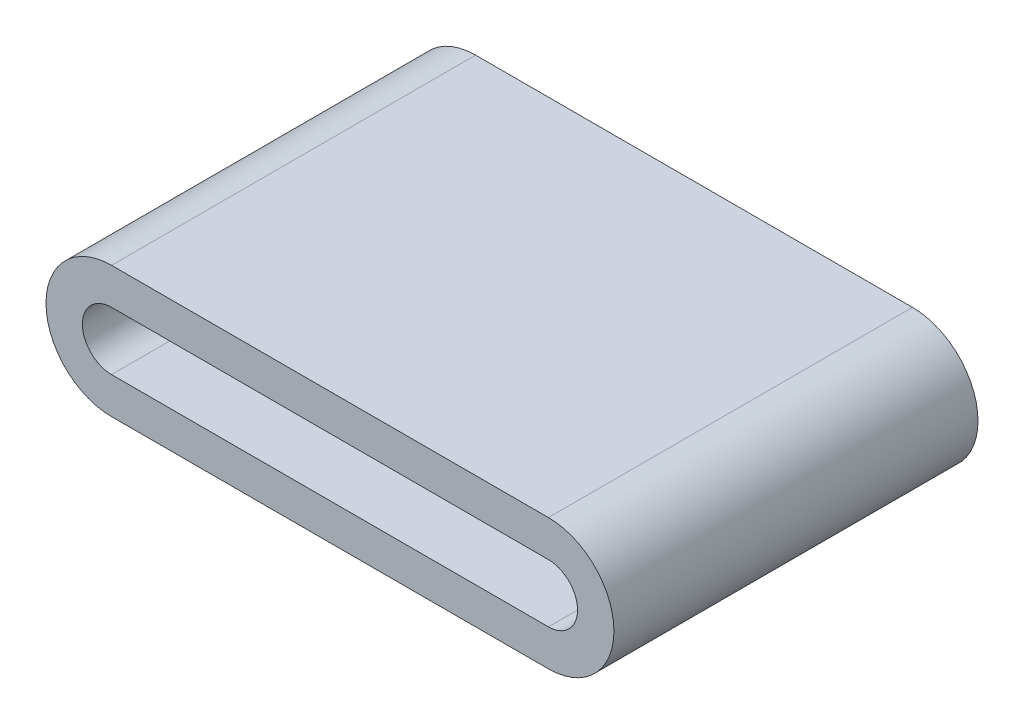
ISO-10303-21;
HEADER;
FILE_DESCRIPTION(('STEP AP214'),'2;1');
FILE_NAME('part.step','',(''),(''),'','','');
FILE_SCHEMA(('AUTOMOTIVE_DESIGN { 1 0 10303 214 1 1 1 1 }'));
ENDSEC;
DATA;
#1=APPLICATION_CONTEXT('core data for automotive mechanical design processes');
#2=APPLICATION_PROTOCOL_DEFINITION('international standard','automotive_design',2000,#1);
#3=PRODUCT_CONTEXT('',#1,'mechanical');
#4=PRODUCT('Part','Part','',(#3));
#5=PRODUCT_RELATED_PRODUCT_CATEGORY('part','',(#4));
#6=PRODUCT_DEFINITION_FORMATION('','',#4);
#7=PRODUCT_DEFINITION_CONTEXT('part definition',#1,'design');
#8=PRODUCT_DEFINITION('design','',#6,#7);
#9=PRODUCT_DEFINITION_SHAPE('','',#8);
#10=(LENGTH_UNIT() NAMED_UNIT(*) SI_UNIT(.MILLI.,.METRE.));
#11=(NAMED_UNIT(*) PLANE_ANGLE_UNIT() SI_UNIT($,.RADIAN.));
#12=(NAMED_UNIT(*) SI_UNIT($,.STERADIAN.) SOLID_ANGLE_UNIT());
#13=UNCERTAINTY_MEASURE_WITH_UNIT(LENGTH_MEASURE(1.E-05),#10,'distance_accuracy_value','');
#14=(GEOMETRIC_REPRESENTATION_CONTEXT(3) GLOBAL_UNCERTAINTY_ASSIGNED_CONTEXT((#13)) GLOBAL_UNIT_ASSIGNED_CONTEXT((#10,
#11,#12)) REPRESENTATION_CONTEXT('',''));
#15=CARTESIAN_POINT('',(0.,0.,0.));
#16=DIRECTION('',(0.,0.,1.));
#17=DIRECTION('',(1.,0.,0.));
#18=AXIS2_PLACEMENT_3D('',#15,#16,#17);
#19=CARTESIAN_POINT('',(-3.,0.,5.));
#20=DIRECTION('',(0.,0.,1.));
#21=DIRECTION('',(1.,0.,0.));
#22=AXIS2_PLACEMENT_3D('',#19,#20,#21);
#23=PLANE('',#22);
#24=CARTESIAN_POINT('',(-3.,0.,5.));
#25=DIRECTION('',(0.,0.,1.));
#26=DIRECTION('',(1.,0.,0.));
#27=AXIS2_PLACEMENT_3D('',#24,#25,#26);
#28=CIRCLE('',#27,0.9);
#29=CARTESIAN_POINT('',(-3.,0.9,5.));
#30=VERTEX_POINT('',#29);
#31=CARTESIAN_POINT('',(-3.,-0.9,5.));
#32=VERTEX_POINT('',#31);
#33=EDGE_CURVE('E119',#30,#32,#28,.T.);
#34=ORIENTED_EDGE('',*,*,#33,.T.);
#35=DIRECTION('',(1.,0.,0.));
#36=VECTOR('',#35,1.);
#37=CARTESIAN_POINT('',(-3.,-0.9,5.));
#38=LINE('',#37,#36);
#39=CARTESIAN_POINT('',(3.,-0.9,5.));
#40=VERTEX_POINT('',#39);
#41=EDGE_CURVE('E122',#32,#40,#38,.T.);
#42=ORIENTED_EDGE('',*,*,#41,.T.);
#43=CARTESIAN_POINT('',(3.,0.,5.));
#44=DIRECTION('',(0.,0.,1.));
#45=DIRECTION('',(1.,0.,0.));
#46=AXIS2_PLACEMENT_3D('',#43,#44,#45);
#47=CIRCLE('',#46,0.9);
#48=CARTESIAN_POINT('',(3.,0.9,5.));
#49=VERTEX_POINT('',#48);
#50=EDGE_CURVE('E121',#40,#49,#47,.T.);
#51=ORIENTED_EDGE('',*,*,#50,.T.);
#52=DIRECTION('',(-1.,0.,0.));
#53=VECTOR('',#52,1.);
#54=CARTESIAN_POINT('',(-3.,0.9,5.));
#55=LINE('',#54,#53);
#56=EDGE_CURVE('E130',#49,#30,#55,.T.);
#57=ORIENTED_EDGE('',*,*,#56,.T.);
#58=EDGE_LOOP('',(#34,#42,#51,#57));
#59=FACE_BOUND('',#58,.T.);
#60=DIRECTION('',(1.,0.,0.));
#61=VECTOR('',#60,1.);
#62=CARTESIAN_POINT('',(-3.,-0.4,5.));
#63=LINE('',#62,#61);
#64=CARTESIAN_POINT('',(-3.,-0.4,5.));
#65=VERTEX_POINT('',#64);
#66=CARTESIAN_POINT('',(3.,-0.4,5.));
#67=VERTEX_POINT('',#66);
#68=EDGE_CURVE('E89',#65,#67,#63,.T.);
#69=ORIENTED_EDGE('',*,*,#68,.F.);
#70=CARTESIAN_POINT('',(-3.,0.,5.));
#71=DIRECTION('',(0.,0.,1.));
#72=DIRECTION('',(1.,0.,0.));
#73=AXIS2_PLACEMENT_3D('',#70,#71,#72);
#74=CIRCLE('',#73,0.4);
#75=CARTESIAN_POINT('',(-3.,0.4,5.));
#76=VERTEX_POINT('',#75);
#77=EDGE_CURVE('E85',#76,#65,#74,.T.);
#78=ORIENTED_EDGE('',*,*,#77,.F.);
#79=DIRECTION('',(-1.,0.,0.));
#80=VECTOR('',#79,1.);
#81=CARTESIAN_POINT('',(-3.,0.4,5.));
#82=LINE('',#81,#80);
#83=CARTESIAN_POINT('',(3.,0.4,5.));
#84=VERTEX_POINT('',#83);
#85=EDGE_CURVE('E102',#84,#76,#82,.T.);
#86=ORIENTED_EDGE('',*,*,#85,.F.);
#87=CARTESIAN_POINT('',(3.,0.,5.));
#88=DIRECTION('',(0.,0.,1.));
#89=DIRECTION('',(1.,0.,0.));
#90=AXIS2_PLACEMENT_3D('',#87,#88,#89);
#91=CIRCLE('',#90,0.4);
#92=EDGE_CURVE('E105',#67,#84,#91,.T.);
#93=ORIENTED_EDGE('',*,*,#92,.F.);
#94=EDGE_LOOP('',(#69,#78,#86,#93));
#95=FACE_BOUND('',#94,.T.);
#96=ADVANCED_FACE('F17',(#59,#95),#23,.T.);
#97=CARTESIAN_POINT('',(-3.,0.,0.));
#98=DIRECTION('',(0.,0.,1.));
#99=DIRECTION('',(1.,0.,0.));
#100=AXIS2_PLACEMENT_3D('',#97,#98,#99);
#101=PLANE('',#100);
#102=CARTESIAN_POINT('',(-3.,0.,0.));
#103=DIRECTION('',(0.,0.,1.));
#104=DIRECTION('',(1.,0.,0.));
#105=AXIS2_PLACEMENT_3D('',#102,#103,#104);
#106=CIRCLE('',#105,0.9);
#107=CARTESIAN_POINT('',(-3.,0.9,0.));
#108=VERTEX_POINT('',#107);
#109=CARTESIAN_POINT('',(-3.,-0.9,0.));
#110=VERTEX_POINT('',#109);
#111=EDGE_CURVE('E98',#108,#110,#106,.T.);
#112=ORIENTED_EDGE('',*,*,#111,.F.);
#113=DIRECTION('',(-1.,0.,0.));
#114=VECTOR('',#113,1.);
#115=CARTESIAN_POINT('',(-3.,0.9,0.));
#116=LINE('',#115,#114);
#117=CARTESIAN_POINT('',(3.,0.9,0.));
#118=VERTEX_POINT('',#117);
#119=EDGE_CURVE('E125',#118,#108,#116,.T.);
#120=ORIENTED_EDGE('',*,*,#119,.F.);
#121=CARTESIAN_POINT('',(3.,0.,0.));
#122=DIRECTION('',(0.,0.,1.));
#123=DIRECTION('',(1.,0.,0.));
#124=AXIS2_PLACEMENT_3D('',#121,#122,#123);
#125=CIRCLE('',#124,0.9);
#126=CARTESIAN_POINT('',(3.,-0.9,0.));
#127=VERTEX_POINT('',#126);
#128=EDGE_CURVE('E132',#127,#118,#125,.T.);
#129=ORIENTED_EDGE('',*,*,#128,.F.);
#130=DIRECTION('',(1.,0.,0.));
#131=VECTOR('',#130,1.);
#132=CARTESIAN_POINT('',(-3.,-0.9,0.));
#133=LINE('',#132,#131);
#134=EDGE_CURVE('E131',#110,#127,#133,.T.);
#135=ORIENTED_EDGE('',*,*,#134,.F.);
#136=EDGE_LOOP('',(#112,#120,#129,#135));
#137=FACE_BOUND('',#136,.T.);
#138=CARTESIAN_POINT('',(-3.,0.,0.));
#139=DIRECTION('',(0.,0.,1.));
#140=DIRECTION('',(1.,0.,0.));
#141=AXIS2_PLACEMENT_3D('',#138,#139,#140);
#142=CIRCLE('',#141,0.4);
#143=CARTESIAN_POINT('',(-3.,0.4,0.));
#144=VERTEX_POINT('',#143);
#145=CARTESIAN_POINT('',(-3.,-0.4,0.));
#146=VERTEX_POINT('',#145);
#147=EDGE_CURVE('E37',#144,#146,#142,.T.);
#148=ORIENTED_EDGE('',*,*,#147,.T.);
#149=DIRECTION('',(1.,0.,0.));
#150=VECTOR('',#149,1.);
#151=CARTESIAN_POINT('',(-3.,-0.4,0.));
#152=LINE('',#151,#150);
#153=CARTESIAN_POINT('',(3.,-0.4,0.));
#154=VERTEX_POINT('',#153);
#155=EDGE_CURVE('E100',#146,#154,#152,.T.);
#156=ORIENTED_EDGE('',*,*,#155,.T.);
#157=CARTESIAN_POINT('',(3.,0.,0.));
#158=DIRECTION('',(0.,0.,1.));
#159=DIRECTION('',(1.,0.,0.));
#160=AXIS2_PLACEMENT_3D('',#157,#158,#159);
#161=CIRCLE('',#160,0.4);
#162=CARTESIAN_POINT('',(3.,0.4,0.));
#163=VERTEX_POINT('',#162);
#164=EDGE_CURVE('E109',#154,#163,#161,.T.);
#165=ORIENTED_EDGE('',*,*,#164,.T.);
#166=DIRECTION('',(-1.,0.,0.));
#167=VECTOR('',#166,1.);
#168=CARTESIAN_POINT('',(-3.,0.4,0.));
#169=LINE('',#168,#167);
#170=EDGE_CURVE('E93',#163,#144,#169,.T.);
#171=ORIENTED_EDGE('',*,*,#170,.T.);
#172=EDGE_LOOP('',(#148,#156,#165,#171));
#173=FACE_BOUND('',#172,.T.);
#174=ADVANCED_FACE('F151',(#137,#173),#101,.F.);
#175=CARTESIAN_POINT('',(-3.,0.,5.));
#176=DIRECTION('',(0.,0.,-1.));
#177=DIRECTION('',(-1.,0.,0.));
#178=AXIS2_PLACEMENT_3D('',#175,#176,#177);
#179=CYLINDRICAL_SURFACE('',#178,0.9);
#180=ORIENTED_EDGE('',*,*,#111,.T.);
#181=DIRECTION('',(0.,0.,-1.));
#182=VECTOR('',#181,1.);
#183=CARTESIAN_POINT('',(-3.,-0.9,5.));
#184=LINE('',#183,#182);
#185=EDGE_CURVE('E11',#32,#110,#184,.T.);
#186=ORIENTED_EDGE('',*,*,#185,.F.);
#187=ORIENTED_EDGE('',*,*,#33,.F.);
#188=DIRECTION('',(0.,0.,-1.));
#189=VECTOR('',#188,1.);
#190=CARTESIAN_POINT('',(-3.,0.9,5.));
#191=LINE('',#190,#189);
#192=EDGE_CURVE('E128',#30,#108,#191,.T.);
#193=ORIENTED_EDGE('',*,*,#192,.T.);
#194=EDGE_LOOP('',(#180,#186,#187,#193));
#195=FACE_BOUND('',#194,.T.);
#196=ADVANCED_FACE('F19',(#195),#179,.T.);
#197=CARTESIAN_POINT('',(-3.,-0.9,5.));
#198=DIRECTION('',(0.,1.,0.));
#199=DIRECTION('',(0.,0.,1.));
#200=AXIS2_PLACEMENT_3D('',#197,#198,#199);
#201=PLANE('',#200);
#202=ORIENTED_EDGE('',*,*,#134,.T.);
#203=DIRECTION('',(0.,0.,-1.));
#204=VECTOR('',#203,1.);
#205=CARTESIAN_POINT('',(3.,-0.9,5.));
#206=LINE('',#205,#204);
#207=EDGE_CURVE('E25',#40,#127,#206,.T.);
#208=ORIENTED_EDGE('',*,*,#207,.F.);
#209=ORIENTED_EDGE('',*,*,#41,.F.);
#210=ORIENTED_EDGE('',*,*,#185,.T.);
#211=EDGE_LOOP('',(#202,#208,#209,#210));
#212=FACE_BOUND('',#211,.T.);
#213=ADVANCED_FACE('F161',(#212),#201,.F.);
#214=CARTESIAN_POINT('',(3.,0.,5.));
#215=DIRECTION('',(0.,0.,-1.));
#216=DIRECTION('',(-1.,0.,0.));
#217=AXIS2_PLACEMENT_3D('',#214,#215,#216);
#218=CYLINDRICAL_SURFACE('',#217,0.9);
#219=ORIENTED_EDGE('',*,*,#128,.T.);
#220=DIRECTION('',(0.,0.,-1.));
#221=VECTOR('',#220,1.);
#222=CARTESIAN_POINT('',(3.,0.9,5.));
#223=LINE('',#222,#221);
#224=EDGE_CURVE('E138',#49,#118,#223,.T.);
#225=ORIENTED_EDGE('',*,*,#224,.F.);
#226=ORIENTED_EDGE('',*,*,#50,.F.);
#227=ORIENTED_EDGE('',*,*,#207,.T.);
#228=EDGE_LOOP('',(#219,#225,#226,#227));
#229=FACE_BOUND('',#228,.T.);
#230=ADVANCED_FACE('F144',(#229),#218,.T.);
#231=CARTESIAN_POINT('',(-3.,0.9,5.));
#232=DIRECTION('',(0.,-1.,0.));
#233=DIRECTION('',(0.,0.,-1.));
#234=AXIS2_PLACEMENT_3D('',#231,#232,#233);
#235=PLANE('',#234);
#236=ORIENTED_EDGE('',*,*,#119,.T.);
#237=ORIENTED_EDGE('',*,*,#192,.F.);
#238=ORIENTED_EDGE('',*,*,#56,.F.);
#239=ORIENTED_EDGE('',*,*,#224,.T.);
#240=EDGE_LOOP('',(#236,#237,#238,#239));
#241=FACE_BOUND('',#240,.T.);
#242=ADVANCED_FACE('F154',(#241),#235,.F.);
#243=CARTESIAN_POINT('',(-3.,0.,5.));
#244=DIRECTION('',(0.,0.,-1.));
#245=DIRECTION('',(-1.,0.,0.));
#246=AXIS2_PLACEMENT_3D('',#243,#244,#245);
#247=CYLINDRICAL_SURFACE('',#246,0.4);
#248=ORIENTED_EDGE('',*,*,#147,.F.);
#249=DIRECTION('',(0.,0.,-1.));
#250=VECTOR('',#249,1.);
#251=CARTESIAN_POINT('',(-3.,0.4,5.));
#252=LINE('',#251,#250);
#253=EDGE_CURVE('E88',#76,#144,#252,.T.);
#254=ORIENTED_EDGE('',*,*,#253,.F.);
#255=ORIENTED_EDGE('',*,*,#77,.T.);
#256=DIRECTION('',(0.,0.,-1.));
#257=VECTOR('',#256,1.);
#258=CARTESIAN_POINT('',(-3.,-0.4,5.));
#259=LINE('',#258,#257);
#260=EDGE_CURVE('E84',#65,#146,#259,.T.);
#261=ORIENTED_EDGE('',*,*,#260,.T.);
#262=EDGE_LOOP('',(#248,#254,#255,#261));
#263=FACE_BOUND('',#262,.T.);
#264=ADVANCED_FACE('F82',(#263),#247,.F.);
#265=CARTESIAN_POINT('',(-3.,-0.4,5.));
#266=DIRECTION('',(0.,1.,0.));
#267=DIRECTION('',(0.,0.,1.));
#268=AXIS2_PLACEMENT_3D('',#265,#266,#267);
#269=PLANE('',#268);
#270=ORIENTED_EDGE('',*,*,#155,.F.);
#271=ORIENTED_EDGE('',*,*,#260,.F.);
#272=ORIENTED_EDGE('',*,*,#68,.T.);
#273=DIRECTION('',(0.,0.,-1.));
#274=VECTOR('',#273,1.);
#275=CARTESIAN_POINT('',(3.,-0.4,5.));
#276=LINE('',#275,#274);
#277=EDGE_CURVE('E97',#67,#154,#276,.T.);
#278=ORIENTED_EDGE('',*,*,#277,.T.);
#279=EDGE_LOOP('',(#270,#271,#272,#278));
#280=FACE_BOUND('',#279,.T.);
#281=ADVANCED_FACE('F94',(#280),#269,.T.);
#282=CARTESIAN_POINT('',(3.,0.,5.));
#283=DIRECTION('',(0.,0.,-1.));
#284=DIRECTION('',(-1.,0.,0.));
#285=AXIS2_PLACEMENT_3D('',#282,#283,#284);
#286=CYLINDRICAL_SURFACE('',#285,0.4);
#287=ORIENTED_EDGE('',*,*,#164,.F.);
#288=ORIENTED_EDGE('',*,*,#277,.F.);
#289=ORIENTED_EDGE('',*,*,#92,.T.);
#290=DIRECTION('',(0.,0.,-1.));
#291=VECTOR('',#290,1.);
#292=CARTESIAN_POINT('',(3.,0.4,5.));
#293=LINE('',#292,#291);
#294=EDGE_CURVE('E32',#84,#163,#293,.T.);
#295=ORIENTED_EDGE('',*,*,#294,.T.);
#296=EDGE_LOOP('',(#287,#288,#289,#295));
#297=FACE_BOUND('',#296,.T.);
#298=ADVANCED_FACE('F188',(#297),#286,.F.);
#299=CARTESIAN_POINT('',(-3.,0.4,5.));
#300=DIRECTION('',(0.,-1.,0.));
#301=DIRECTION('',(0.,0.,-1.));
#302=AXIS2_PLACEMENT_3D('',#299,#300,#301);
#303=PLANE('',#302);
#304=ORIENTED_EDGE('',*,*,#170,.F.);
#305=ORIENTED_EDGE('',*,*,#294,.F.);
#306=ORIENTED_EDGE('',*,*,#85,.T.);
#307=ORIENTED_EDGE('',*,*,#253,.T.);
#308=EDGE_LOOP('',(#304,#305,#306,#307));
#309=FACE_BOUND('',#308,.T.);
#310=ADVANCED_FACE('F192',(#309),#303,.T.);
#311=CLOSED_SHELL('',(#96,#174,#196,#213,#230,#242,#264,#281,#298,#310));
#312=MANIFOLD_SOLID_BREP('B1',#311);
#313=ADVANCED_BREP_SHAPE_REPRESENTATION('',(#18,#312),#14);
#314=SHAPE_DEFINITION_REPRESENTATION(#9,#313);
ENDSEC;
END-ISO-10303-21;
